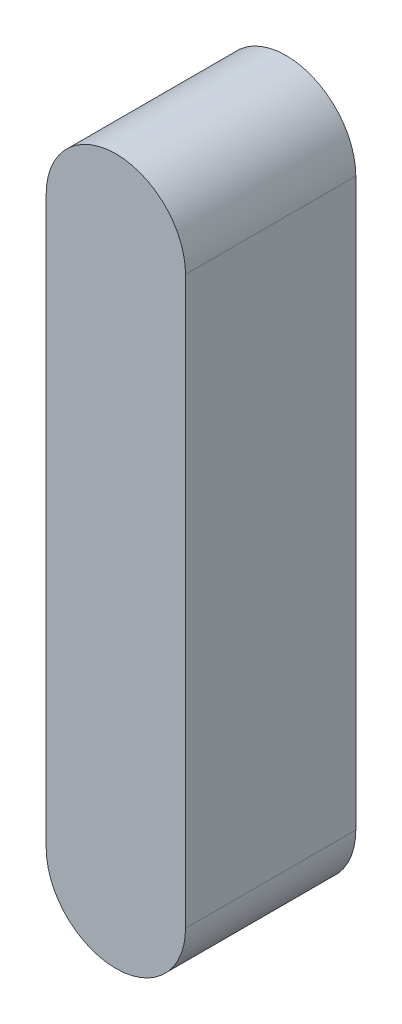
ISO-10303-21;
HEADER;
FILE_DESCRIPTION(('STEP AP214'),'2;1');
FILE_NAME('part.step','',(''),(''),'','','');
FILE_SCHEMA(('AUTOMOTIVE_DESIGN { 1 0 10303 214 1 1 1 1 }'));
ENDSEC;
DATA;
#1=APPLICATION_CONTEXT('core data for automotive mechanical design processes');
#2=APPLICATION_PROTOCOL_DEFINITION('international standard','automotive_design',2000,#1);
#3=PRODUCT_CONTEXT('',#1,'mechanical');
#4=PRODUCT('Part','Part','',(#3));
#5=PRODUCT_RELATED_PRODUCT_CATEGORY('part','',(#4));
#6=PRODUCT_DEFINITION_FORMATION('','',#4);
#7=PRODUCT_DEFINITION_CONTEXT('part definition',#1,'design');
#8=PRODUCT_DEFINITION('design','',#6,#7);
#9=PRODUCT_DEFINITION_SHAPE('','',#8);
#10=(LENGTH_UNIT() NAMED_UNIT(*) SI_UNIT(.MILLI.,.METRE.));
#11=(NAMED_UNIT(*) PLANE_ANGLE_UNIT() SI_UNIT($,.RADIAN.));
#12=(NAMED_UNIT(*) SI_UNIT($,.STERADIAN.) SOLID_ANGLE_UNIT());
#13=UNCERTAINTY_MEASURE_WITH_UNIT(LENGTH_MEASURE(1.E-05),#10,'distance_accuracy_value','');
#14=(GEOMETRIC_REPRESENTATION_CONTEXT(3) GLOBAL_UNCERTAINTY_ASSIGNED_CONTEXT((#13)) GLOBAL_UNIT_ASSIGNED_CONTEXT((#10,
#11,#12)) REPRESENTATION_CONTEXT('',''));
#15=CARTESIAN_POINT('',(0.,0.,0.));
#16=DIRECTION('',(0.,0.,1.));
#17=DIRECTION('',(1.,0.,0.));
#18=AXIS2_PLACEMENT_3D('',#15,#16,#17);
#19=CARTESIAN_POINT('',(-45.,0.,519.597309572676));
#20=DIRECTION('',(1.,0.,0.));
#21=DIRECTION('',(0.,0.,-1.));
#22=AXIS2_PLACEMENT_3D('',#19,#20,#21);
#23=PLANE('',#22);
#24=DIRECTION('',(0.,0.,-1.));
#25=VECTOR('',#24,1.);
#26=CARTESIAN_POINT('',(-45.,0.,519.597309572676));
#27=LINE('',#26,#25);
#28=CARTESIAN_POINT('',(-45.,0.,55.0000000000024));
#29=VERTEX_POINT('',#28);
#30=CARTESIAN_POINT('',(-45.,0.,-54.9999999999977));
#31=VERTEX_POINT('',#30);
#32=EDGE_CURVE('E103',#29,#31,#27,.T.);
#33=ORIENTED_EDGE('',*,*,#32,.F.);
#34=DIRECTION('',(0.,1.,0.));
#35=VECTOR('',#34,1.);
#36=CARTESIAN_POINT('',(-45.,4.44488808893477E-13,55.0000000000024));
#37=LINE('',#36,#35);
#38=CARTESIAN_POINT('',(-45.,365.796731078851,55.0000000000025));
#39=VERTEX_POINT('',#38);
#40=EDGE_CURVE('E45',#29,#39,#37,.T.);
#41=ORIENTED_EDGE('',*,*,#40,.T.);
#42=DIRECTION('',(0.,0.,-1.));
#43=VECTOR('',#42,1.);
#44=CARTESIAN_POINT('',(-45.,365.796731078851,519.597309572676));
#45=LINE('',#44,#43);
#46=CARTESIAN_POINT('',(-45.,365.796731078851,-54.9999999999974));
#47=VERTEX_POINT('',#46);
#48=EDGE_CURVE('E89',#39,#47,#45,.T.);
#49=ORIENTED_EDGE('',*,*,#48,.T.);
#50=DIRECTION('',(0.,1.,0.));
#51=VECTOR('',#50,1.);
#52=CARTESIAN_POINT('',(-45.,-4.64966919757485E-13,-54.9999999999977));
#53=LINE('',#52,#51);
#54=EDGE_CURVE('E99',#31,#47,#53,.T.);
#55=ORIENTED_EDGE('',*,*,#54,.F.);
#56=EDGE_LOOP('',(#33,#41,#49,#55));
#57=FACE_BOUND('',#56,.T.);
#58=ADVANCED_FACE('F41',(#57),#23,.F.);
#59=CARTESIAN_POINT('',(0.,365.796731078851,519.597309572676));
#60=DIRECTION('',(0.,0.,-1.));
#61=DIRECTION('',(-1.,0.,0.));
#62=AXIS2_PLACEMENT_3D('',#59,#60,#61);
#63=CYLINDRICAL_SURFACE('',#62,45.);
#64=ORIENTED_EDGE('',*,*,#48,.F.);
#65=CARTESIAN_POINT('',(0.,365.796731078851,55.0000000000029));
#66=DIRECTION('',(0.,0.,-0.999999999999999));
#67=DIRECTION('',(-1.,0.,0.));
#68=AXIS2_PLACEMENT_3D('',#65,#66,#67);
#69=CIRCLE('',#68,45.);
#70=CARTESIAN_POINT('',(45.,365.796731078851,55.000000000003));
#71=VERTEX_POINT('',#70);
#72=EDGE_CURVE('E85',#39,#71,#69,.T.);
#73=ORIENTED_EDGE('',*,*,#72,.T.);
#74=DIRECTION('',(0.,0.,-1.));
#75=VECTOR('',#74,1.);
#76=CARTESIAN_POINT('',(45.,365.796731078851,519.597309572676));
#77=LINE('',#76,#75);
#78=CARTESIAN_POINT('',(45.,365.796731078851,-54.9999999999974));
#79=VERTEX_POINT('',#78);
#80=EDGE_CURVE('E80',#71,#79,#77,.T.);
#81=ORIENTED_EDGE('',*,*,#80,.T.);
#82=CARTESIAN_POINT('',(0.,365.796731078851,-54.9999999999973));
#83=DIRECTION('',(0.,0.,0.999999999999999));
#84=DIRECTION('',(1.,0.,0.));
#85=AXIS2_PLACEMENT_3D('',#82,#83,#84);
#86=CIRCLE('',#85,45.);
#87=EDGE_CURVE('E84',#47,#79,#86,.F.);
#88=ORIENTED_EDGE('',*,*,#87,.F.);
#89=EDGE_LOOP('',(#64,#73,#81,#88));
#90=FACE_BOUND('',#89,.T.);
#91=ADVANCED_FACE('F83',(#90),#63,.T.);
#92=CARTESIAN_POINT('',(45.,0.,519.597309572676));
#93=DIRECTION('',(-1.,0.,0.));
#94=DIRECTION('',(0.,0.,1.));
#95=AXIS2_PLACEMENT_3D('',#92,#93,#94);
#96=PLANE('',#95);
#97=ORIENTED_EDGE('',*,*,#80,.F.);
#98=DIRECTION('',(0.,-1.,0.));
#99=VECTOR('',#98,1.);
#100=CARTESIAN_POINT('',(45.,4.44488808893477E-13,55.0000000000026));
#101=LINE('',#100,#99);
#102=CARTESIAN_POINT('',(45.,0.,55.0000000000026));
#103=VERTEX_POINT('',#102);
#104=EDGE_CURVE('E50',#71,#103,#101,.T.);
#105=ORIENTED_EDGE('',*,*,#104,.T.);
#106=DIRECTION('',(0.,0.,-1.));
#107=VECTOR('',#106,1.);
#108=CARTESIAN_POINT('',(45.,0.,519.597309572676));
#109=LINE('',#108,#107);
#110=CARTESIAN_POINT('',(45.,0.,-54.9999999999975));
#111=VERTEX_POINT('',#110);
#112=EDGE_CURVE('E88',#103,#111,#109,.T.);
#113=ORIENTED_EDGE('',*,*,#112,.T.);
#114=DIRECTION('',(0.,-1.,0.));
#115=VECTOR('',#114,1.);
#116=CARTESIAN_POINT('',(45.,-4.64966919757485E-13,-54.9999999999975));
#117=LINE('',#116,#115);
#118=EDGE_CURVE('E96',#79,#111,#117,.T.);
#119=ORIENTED_EDGE('',*,*,#118,.F.);
#120=EDGE_LOOP('',(#97,#105,#113,#119));
#121=FACE_BOUND('',#120,.T.);
#122=ADVANCED_FACE('F101',(#121),#96,.F.);
#123=CARTESIAN_POINT('',(0.,0.,519.597309572676));
#124=DIRECTION('',(0.,0.,-1.));
#125=DIRECTION('',(-1.,0.,0.));
#126=AXIS2_PLACEMENT_3D('',#123,#124,#125);
#127=CYLINDRICAL_SURFACE('',#126,45.);
#128=ORIENTED_EDGE('',*,*,#112,.F.);
#129=CARTESIAN_POINT('',(0.,0.,55.0000000000025));
#130=DIRECTION('',(0.,0.,-0.999999999999999));
#131=DIRECTION('',(-1.,0.,0.));
#132=AXIS2_PLACEMENT_3D('',#129,#130,#131);
#133=CIRCLE('',#132,45.);
#134=EDGE_CURVE('E11',#103,#29,#133,.T.);
#135=ORIENTED_EDGE('',*,*,#134,.T.);
#136=ORIENTED_EDGE('',*,*,#32,.T.);
#137=CARTESIAN_POINT('',(0.,0.,-54.9999999999976));
#138=DIRECTION('',(0.,0.,0.999999999999999));
#139=DIRECTION('',(1.,0.,0.));
#140=AXIS2_PLACEMENT_3D('',#137,#138,#139);
#141=CIRCLE('',#140,45.);
#142=EDGE_CURVE('E104',#111,#31,#141,.F.);
#143=ORIENTED_EDGE('',*,*,#142,.F.);
#144=EDGE_LOOP('',(#128,#135,#136,#143));
#145=FACE_BOUND('',#144,.T.);
#146=ADVANCED_FACE('F43',(#145),#127,.T.);
#147=CARTESIAN_POINT('',(-373.041437074047,141.804099178098,55.0000000000016));
#148=DIRECTION('',(0.,0.,-0.999999999999999));
#149=DIRECTION('',(-0.99682439746677,0.0796311535456452,0.));
#150=AXIS2_PLACEMENT_3D('',#147,#148,#149);
#151=PLANE('',#150);
#152=ORIENTED_EDGE('',*,*,#104,.F.);
#153=ORIENTED_EDGE('',*,*,#72,.F.);
#154=ORIENTED_EDGE('',*,*,#40,.F.);
#155=ORIENTED_EDGE('',*,*,#134,.F.);
#156=EDGE_LOOP('',(#152,#153,#154,#155));
#157=FACE_BOUND('',#156,.T.);
#158=ADVANCED_FACE('F115',(#157),#151,.F.);
#159=CARTESIAN_POINT('',(-373.041437074046,141.804099178098,-54.9999999999983));
#160=DIRECTION('',(0.,0.,0.999999999999999));
#161=DIRECTION('',(0.99682439746677,-0.0796311535456453,0.));
#162=AXIS2_PLACEMENT_3D('',#159,#160,#161);
#163=PLANE('',#162);
#164=ORIENTED_EDGE('',*,*,#142,.T.);
#165=ORIENTED_EDGE('',*,*,#54,.T.);
#166=ORIENTED_EDGE('',*,*,#87,.T.);
#167=ORIENTED_EDGE('',*,*,#118,.T.);
#168=EDGE_LOOP('',(#164,#165,#166,#167));
#169=FACE_BOUND('',#168,.T.);
#170=ADVANCED_FACE('F95',(#169),#163,.F.);
#171=CLOSED_SHELL('',(#58,#91,#122,#146,#158,#170));
#172=MANIFOLD_SOLID_BREP('B2',#171);
#173=ADVANCED_BREP_SHAPE_REPRESENTATION('',(#18,#172),#14);
#174=SHAPE_DEFINITION_REPRESENTATION(#9,#173);
ENDSEC;
END-ISO-10303-21;
